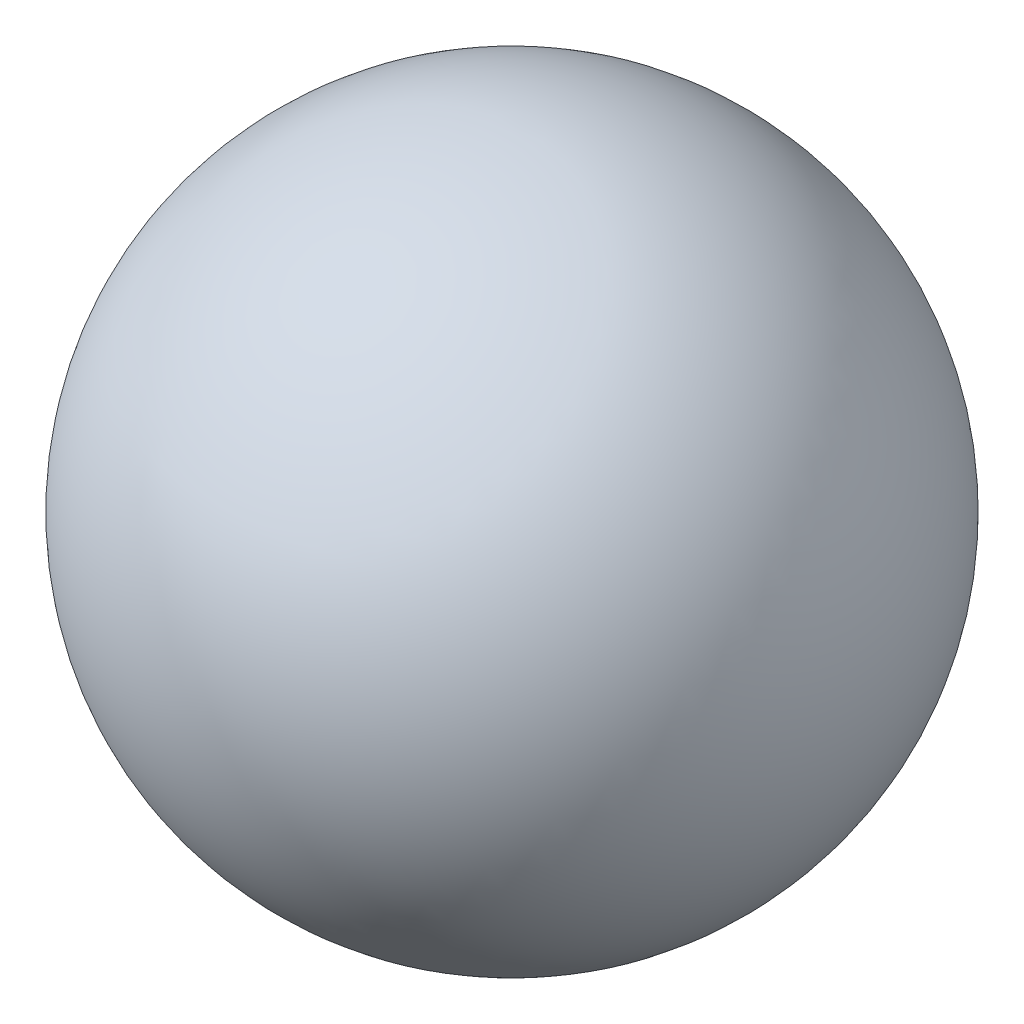
ISO-10303-21;
HEADER;
FILE_DESCRIPTION(('STEP AP214'),'2;1');
FILE_NAME('part.step','',(''),(''),'','','');
FILE_SCHEMA(('AUTOMOTIVE_DESIGN { 1 0 10303 214 1 1 1 1 }'));
ENDSEC;
DATA;
#1=APPLICATION_CONTEXT('core data for automotive mechanical design processes');
#2=APPLICATION_PROTOCOL_DEFINITION('international standard','automotive_design',2000,#1);
#3=PRODUCT_CONTEXT('',#1,'mechanical');
#4=PRODUCT('Part','Part','',(#3));
#5=PRODUCT_RELATED_PRODUCT_CATEGORY('part','',(#4));
#6=PRODUCT_DEFINITION_FORMATION('','',#4);
#7=PRODUCT_DEFINITION_CONTEXT('part definition',#1,'design');
#8=PRODUCT_DEFINITION('design','',#6,#7);
#9=PRODUCT_DEFINITION_SHAPE('','',#8);
#10=(LENGTH_UNIT() NAMED_UNIT(*) SI_UNIT(.MILLI.,.METRE.));
#11=(NAMED_UNIT(*) PLANE_ANGLE_UNIT() SI_UNIT($,.RADIAN.));
#12=(NAMED_UNIT(*) SI_UNIT($,.STERADIAN.) SOLID_ANGLE_UNIT());
#13=UNCERTAINTY_MEASURE_WITH_UNIT(LENGTH_MEASURE(1.E-05),#10,'distance_accuracy_value','');
#14=(GEOMETRIC_REPRESENTATION_CONTEXT(3) GLOBAL_UNCERTAINTY_ASSIGNED_CONTEXT((#13)) GLOBAL_UNIT_ASSIGNED_CONTEXT((#10,
#11,#12)) REPRESENTATION_CONTEXT('',''));
#15=CARTESIAN_POINT('',(0.,0.,0.));
#16=DIRECTION('',(0.,0.,1.));
#17=DIRECTION('',(1.,0.,0.));
#18=AXIS2_PLACEMENT_3D('',#15,#16,#17);
#19=CARTESIAN_POINT('',(0.,0.,0.));
#20=DIRECTION('',(0.,1.,0.));
#21=DIRECTION('',(0.,0.,-1.));
#22=AXIS2_PLACEMENT_3D('',#19,#20,#21);
#23=SPHERICAL_SURFACE('',#22,18.415);
#24=CARTESIAN_POINT('',(0.,18.415,0.));
#25=VERTEX_POINT('',#24);
#26=VERTEX_LOOP('',#25);
#27=FACE_BOUND('',#26,.T.);
#28=ADVANCED_FACE('F28',(#27),#23,.T.);
#29=CLOSED_SHELL('',(#28));
#30=MANIFOLD_SOLID_BREP('B2',#29);
#31=ADVANCED_BREP_SHAPE_REPRESENTATION('',(#18,#30),#14);
#32=SHAPE_DEFINITION_REPRESENTATION(#9,#31);
ENDSEC;
END-ISO-10303-21;
